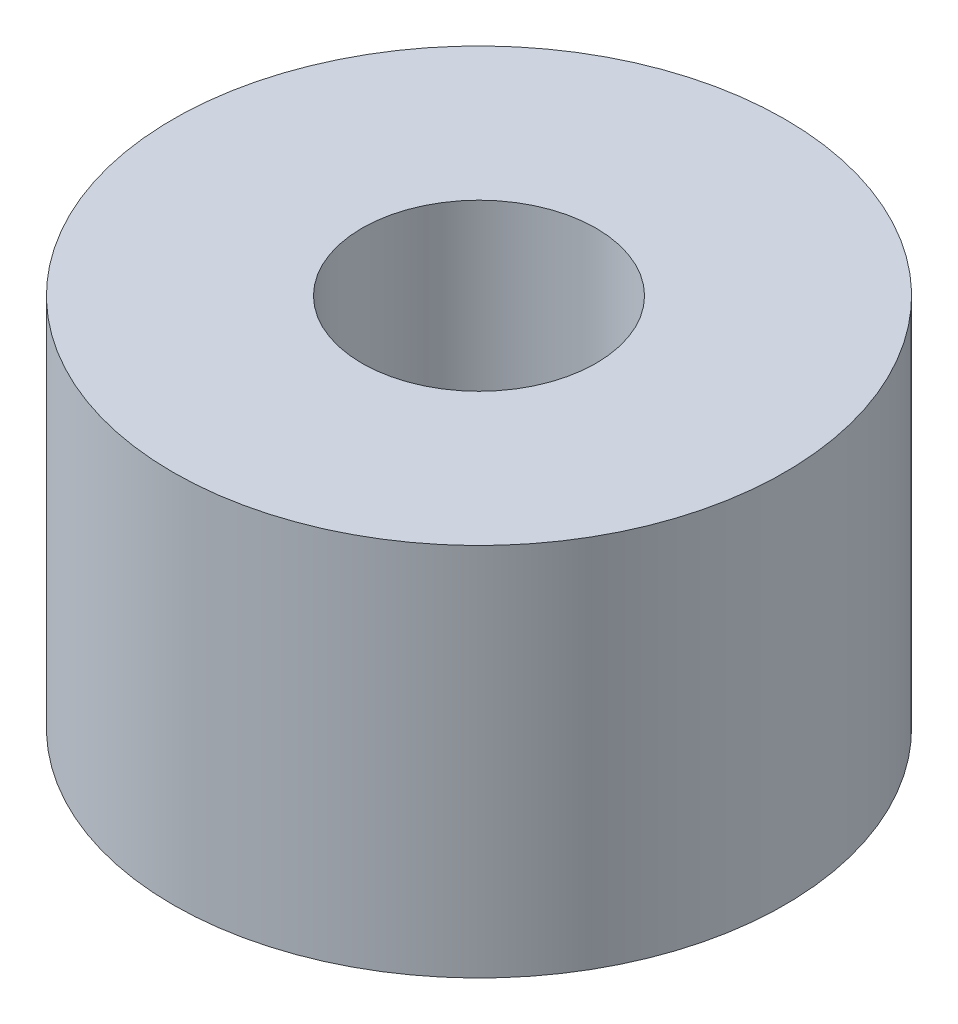
ISO-10303-21;
HEADER;
FILE_DESCRIPTION(('STEP AP214'),'2;1');
FILE_NAME('part.step','',(''),(''),'','','');
FILE_SCHEMA(('AUTOMOTIVE_DESIGN { 1 0 10303 214 1 1 1 1 }'));
ENDSEC;
DATA;
#1=APPLICATION_CONTEXT('core data for automotive mechanical design processes');
#2=APPLICATION_PROTOCOL_DEFINITION('international standard','automotive_design',2000,#1);
#3=PRODUCT_CONTEXT('',#1,'mechanical');
#4=PRODUCT('Part','Part','',(#3));
#5=PRODUCT_RELATED_PRODUCT_CATEGORY('part','',(#4));
#6=PRODUCT_DEFINITION_FORMATION('','',#4);
#7=PRODUCT_DEFINITION_CONTEXT('part definition',#1,'design');
#8=PRODUCT_DEFINITION('design','',#6,#7);
#9=PRODUCT_DEFINITION_SHAPE('','',#8);
#10=(LENGTH_UNIT() NAMED_UNIT(*) SI_UNIT(.MILLI.,.METRE.));
#11=(NAMED_UNIT(*) PLANE_ANGLE_UNIT() SI_UNIT($,.RADIAN.));
#12=(NAMED_UNIT(*) SI_UNIT($,.STERADIAN.) SOLID_ANGLE_UNIT());
#13=UNCERTAINTY_MEASURE_WITH_UNIT(LENGTH_MEASURE(1.E-05),#10,'distance_accuracy_value','');
#14=(GEOMETRIC_REPRESENTATION_CONTEXT(3) GLOBAL_UNCERTAINTY_ASSIGNED_CONTEXT((#13)) GLOBAL_UNIT_ASSIGNED_CONTEXT((#10,
#11,#12)) REPRESENTATION_CONTEXT('',''));
#15=CARTESIAN_POINT('',(0.,0.,0.));
#16=DIRECTION('',(0.,0.,1.));
#17=DIRECTION('',(1.,0.,0.));
#18=AXIS2_PLACEMENT_3D('',#15,#16,#17);
#19=CARTESIAN_POINT('',(0.,15.24,0.));
#20=DIRECTION('',(0.,1.,0.));
#21=DIRECTION('',(0.,0.,1.));
#22=AXIS2_PLACEMENT_3D('',#19,#20,#21);
#23=PLANE('',#22);
#24=CARTESIAN_POINT('',(0.,15.24,0.));
#25=DIRECTION('',(0.,1.,0.));
#26=DIRECTION('',(0.,0.,1.));
#27=AXIS2_PLACEMENT_3D('',#24,#25,#26);
#28=CIRCLE('',#27,12.446);
#29=CARTESIAN_POINT('',(0.,15.24,12.446));
#30=VERTEX_POINT('',#29);
#31=EDGE_CURVE('E10',#30,#30,#28,.T.);
#32=ORIENTED_EDGE('',*,*,#31,.T.);
#33=EDGE_LOOP('',(#32));
#34=FACE_BOUND('',#33,.T.);
#35=CARTESIAN_POINT('',(0.,15.24,0.));
#36=DIRECTION('',(0.,1.,0.));
#37=DIRECTION('',(0.,0.,1.));
#38=AXIS2_PLACEMENT_3D('',#35,#36,#37);
#39=CIRCLE('',#38,4.7625);
#40=CARTESIAN_POINT('',(0.,15.24,4.7625));
#41=VERTEX_POINT('',#40);
#42=EDGE_CURVE('E44',#41,#41,#39,.T.);
#43=ORIENTED_EDGE('',*,*,#42,.F.);
#44=EDGE_LOOP('',(#43));
#45=FACE_BOUND('',#44,.T.);
#46=ADVANCED_FACE('F33',(#34,#45),#23,.T.);
#47=CARTESIAN_POINT('',(0.,0.,0.));
#48=DIRECTION('',(0.,1.,0.));
#49=DIRECTION('',(0.,0.,1.));
#50=AXIS2_PLACEMENT_3D('',#47,#48,#49);
#51=PLANE('',#50);
#52=CARTESIAN_POINT('',(0.,0.,0.));
#53=DIRECTION('',(0.,1.,0.));
#54=DIRECTION('',(0.,0.,1.));
#55=AXIS2_PLACEMENT_3D('',#52,#53,#54);
#56=CIRCLE('',#55,12.446);
#57=CARTESIAN_POINT('',(0.,0.,12.446));
#58=VERTEX_POINT('',#57);
#59=EDGE_CURVE('E37',#58,#58,#56,.T.);
#60=ORIENTED_EDGE('',*,*,#59,.F.);
#61=EDGE_LOOP('',(#60));
#62=FACE_BOUND('',#61,.T.);
#63=CARTESIAN_POINT('',(0.,0.,0.));
#64=DIRECTION('',(0.,1.,0.));
#65=DIRECTION('',(0.,0.,1.));
#66=AXIS2_PLACEMENT_3D('',#63,#64,#65);
#67=CIRCLE('',#66,4.7625);
#68=CARTESIAN_POINT('',(0.,0.,4.7625));
#69=VERTEX_POINT('',#68);
#70=EDGE_CURVE('E46',#69,#69,#67,.T.);
#71=ORIENTED_EDGE('',*,*,#70,.T.);
#72=EDGE_LOOP('',(#71));
#73=FACE_BOUND('',#72,.T.);
#74=ADVANCED_FACE('F56',(#62,#73),#51,.F.);
#75=CARTESIAN_POINT('',(0.,15.24,0.));
#76=DIRECTION('',(0.,-1.,0.));
#77=DIRECTION('',(0.,0.,-1.));
#78=AXIS2_PLACEMENT_3D('',#75,#76,#77);
#79=CYLINDRICAL_SURFACE('',#78,12.446);
#80=ORIENTED_EDGE('',*,*,#31,.F.);
#81=EDGE_LOOP('',(#80));
#82=FACE_BOUND('',#81,.T.);
#83=ORIENTED_EDGE('',*,*,#59,.T.);
#84=EDGE_LOOP('',(#83));
#85=FACE_BOUND('',#84,.T.);
#86=ADVANCED_FACE('F35',(#82,#85),#79,.T.);
#87=CARTESIAN_POINT('',(0.,15.24,0.));
#88=DIRECTION('',(0.,-1.,0.));
#89=DIRECTION('',(0.,0.,-1.));
#90=AXIS2_PLACEMENT_3D('',#87,#88,#89);
#91=CYLINDRICAL_SURFACE('',#90,4.7625);
#92=ORIENTED_EDGE('',*,*,#42,.T.);
#93=EDGE_LOOP('',(#92));
#94=FACE_BOUND('',#93,.T.);
#95=ORIENTED_EDGE('',*,*,#70,.F.);
#96=EDGE_LOOP('',(#95));
#97=FACE_BOUND('',#96,.T.);
#98=ADVANCED_FACE('F52',(#94,#97),#91,.F.);
#99=CLOSED_SHELL('',(#46,#74,#86,#98));
#100=MANIFOLD_SOLID_BREP('B2',#99);
#101=ADVANCED_BREP_SHAPE_REPRESENTATION('',(#18,#100),#14);
#102=SHAPE_DEFINITION_REPRESENTATION(#9,#101);
ENDSEC;
END-ISO-10303-21;
